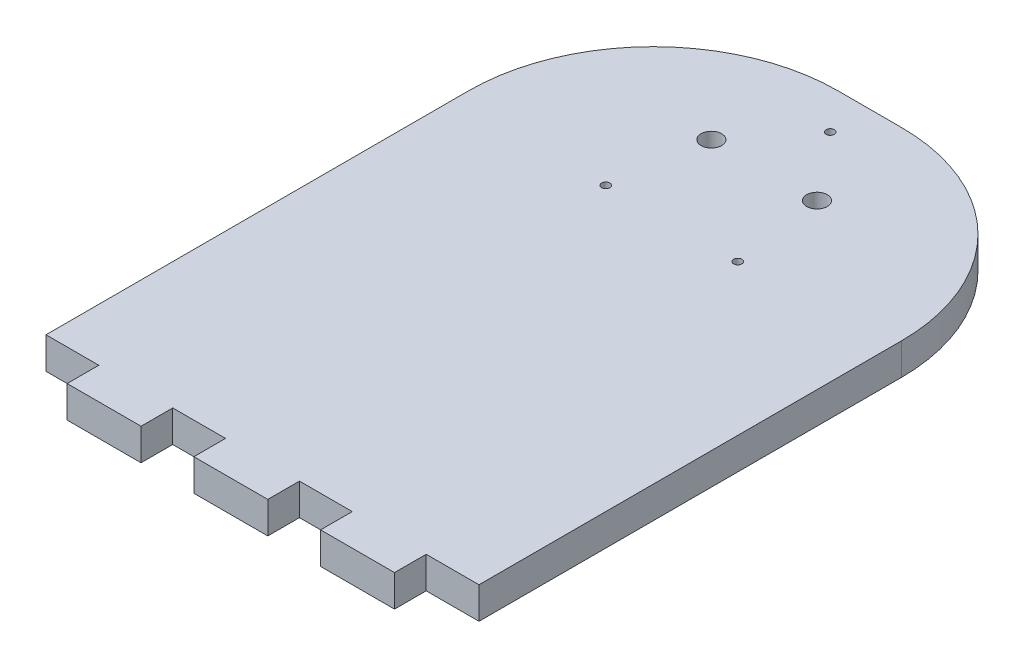
ISO-10303-21;
HEADER;
FILE_DESCRIPTION(('STEP AP214'),'2;1');
FILE_NAME('part.step','',(''),(''),'','','');
FILE_SCHEMA(('AUTOMOTIVE_DESIGN { 1 0 10303 214 1 1 1 1 }'));
ENDSEC;
DATA;
#1=APPLICATION_CONTEXT('core data for automotive mechanical design processes');
#2=APPLICATION_PROTOCOL_DEFINITION('international standard','automotive_design',2000,#1);
#3=PRODUCT_CONTEXT('',#1,'mechanical');
#4=PRODUCT('Part','Part','',(#3));
#5=PRODUCT_RELATED_PRODUCT_CATEGORY('part','',(#4));
#6=PRODUCT_DEFINITION_FORMATION('','',#4);
#7=PRODUCT_DEFINITION_CONTEXT('part definition',#1,'design');
#8=PRODUCT_DEFINITION('design','',#6,#7);
#9=PRODUCT_DEFINITION_SHAPE('','',#8);
#10=(LENGTH_UNIT() NAMED_UNIT(*) SI_UNIT(.MILLI.,.METRE.));
#11=(NAMED_UNIT(*) PLANE_ANGLE_UNIT() SI_UNIT($,.RADIAN.));
#12=(NAMED_UNIT(*) SI_UNIT($,.STERADIAN.) SOLID_ANGLE_UNIT());
#13=UNCERTAINTY_MEASURE_WITH_UNIT(LENGTH_MEASURE(1.E-05),#10,'distance_accuracy_value','');
#14=(GEOMETRIC_REPRESENTATION_CONTEXT(3) GLOBAL_UNCERTAINTY_ASSIGNED_CONTEXT((#13)) GLOBAL_UNIT_ASSIGNED_CONTEXT((#10,
#11,#12)) REPRESENTATION_CONTEXT('',''));
#15=CARTESIAN_POINT('',(0.,0.,0.));
#16=DIRECTION('',(0.,0.,1.));
#17=DIRECTION('',(1.,0.,0.));
#18=AXIS2_PLACEMENT_3D('',#15,#16,#17);
#19=CARTESIAN_POINT('',(164.,12.,-230.));
#20=DIRECTION('',(1.,0.,0.));
#21=DIRECTION('',(0.,0.,-1.));
#22=AXIS2_PLACEMENT_3D('',#19,#20,#21);
#23=PLANE('',#22);
#24=DIRECTION('',(0.,0.,1.));
#25=VECTOR('',#24,1.);
#26=CARTESIAN_POINT('',(164.,0.,-230.));
#27=LINE('',#26,#25);
#28=CARTESIAN_POINT('',(164.,0.,-160.));
#29=VERTEX_POINT('',#28);
#30=CARTESIAN_POINT('',(164.,0.,0.));
#31=VERTEX_POINT('',#30);
#32=EDGE_CURVE('E208',#29,#31,#27,.T.);
#33=ORIENTED_EDGE('',*,*,#32,.F.);
#34=DIRECTION('',(0.,-1.,0.));
#35=VECTOR('',#34,1.);
#36=CARTESIAN_POINT('',(164.,12.,-160.));
#37=LINE('',#36,#35);
#38=CARTESIAN_POINT('',(164.,12.,-160.));
#39=VERTEX_POINT('',#38);
#40=EDGE_CURVE('E56',#29,#39,#37,.F.);
#41=ORIENTED_EDGE('',*,*,#40,.T.);
#42=DIRECTION('',(0.,0.,1.));
#43=VECTOR('',#42,1.);
#44=CARTESIAN_POINT('',(164.,12.,-230.));
#45=LINE('',#44,#43);
#46=CARTESIAN_POINT('',(164.,12.,0.));
#47=VERTEX_POINT('',#46);
#48=EDGE_CURVE('E158',#39,#47,#45,.T.);
#49=ORIENTED_EDGE('',*,*,#48,.T.);
#50=DIRECTION('',(0.,-1.,0.));
#51=VECTOR('',#50,1.);
#52=CARTESIAN_POINT('',(164.,12.,0.));
#53=LINE('',#52,#51);
#54=EDGE_CURVE('E161',#47,#31,#53,.T.);
#55=ORIENTED_EDGE('',*,*,#54,.T.);
#56=EDGE_LOOP('',(#33,#41,#49,#55));
#57=FACE_BOUND('',#56,.T.);
#58=ADVANCED_FACE('F33',(#57),#23,.T.);
#59=CARTESIAN_POINT('',(164.,12.,-230.));
#60=DIRECTION('',(0.,0.,1.));
#61=DIRECTION('',(1.,0.,0.));
#62=AXIS2_PLACEMENT_3D('',#59,#60,#61);
#63=PLANE('',#62);
#64=DIRECTION('',(-1.,0.,0.));
#65=VECTOR('',#64,1.);
#66=CARTESIAN_POINT('',(164.,12.,-230.));
#67=LINE('',#66,#65);
#68=CARTESIAN_POINT('',(94.,12.,-230.));
#69=VERTEX_POINT('',#68);
#70=CARTESIAN_POINT('',(70.,12.,-230.));
#71=VERTEX_POINT('',#70);
#72=EDGE_CURVE('E178',#69,#71,#67,.T.);
#73=ORIENTED_EDGE('',*,*,#72,.F.);
#74=DIRECTION('',(0.,-1.,0.));
#75=VECTOR('',#74,1.);
#76=CARTESIAN_POINT('',(94.,0.,-230.));
#77=LINE('',#76,#75);
#78=CARTESIAN_POINT('',(94.,0.,-230.));
#79=VERTEX_POINT('',#78);
#80=EDGE_CURVE('E188',#69,#79,#77,.T.);
#81=ORIENTED_EDGE('',*,*,#80,.T.);
#82=DIRECTION('',(-1.,0.,0.));
#83=VECTOR('',#82,1.);
#84=CARTESIAN_POINT('',(164.,0.,-230.));
#85=LINE('',#84,#83);
#86=CARTESIAN_POINT('',(70.,0.,-230.));
#87=VERTEX_POINT('',#86);
#88=EDGE_CURVE('E165',#79,#87,#85,.T.);
#89=ORIENTED_EDGE('',*,*,#88,.T.);
#90=DIRECTION('',(0.,-1.,0.));
#91=VECTOR('',#90,1.);
#92=CARTESIAN_POINT('',(70.,12.,-230.));
#93=LINE('',#92,#91);
#94=EDGE_CURVE('E186',#87,#71,#93,.F.);
#95=ORIENTED_EDGE('',*,*,#94,.T.);
#96=EDGE_LOOP('',(#73,#81,#89,#95));
#97=FACE_BOUND('',#96,.T.);
#98=ADVANCED_FACE('F201',(#97),#63,.F.);
#99=CARTESIAN_POINT('',(0.,12.,-230.));
#100=DIRECTION('',(1.,0.,0.));
#101=DIRECTION('',(0.,0.,-1.));
#102=AXIS2_PLACEMENT_3D('',#99,#100,#101);
#103=PLANE('',#102);
#104=DIRECTION('',(0.,0.,1.));
#105=VECTOR('',#104,1.);
#106=CARTESIAN_POINT('',(0.,12.,-230.));
#107=LINE('',#106,#105);
#108=CARTESIAN_POINT('',(0.,12.,-160.));
#109=VERTEX_POINT('',#108);
#110=CARTESIAN_POINT('',(0.,12.,0.));
#111=VERTEX_POINT('',#110);
#112=EDGE_CURVE('E182',#109,#111,#107,.T.);
#113=ORIENTED_EDGE('',*,*,#112,.F.);
#114=DIRECTION('',(0.,-1.,0.));
#115=VECTOR('',#114,1.);
#116=CARTESIAN_POINT('',(0.,12.,-160.));
#117=LINE('',#116,#115);
#118=CARTESIAN_POINT('',(0.,0.,-160.));
#119=VERTEX_POINT('',#118);
#120=EDGE_CURVE('E11',#109,#119,#117,.T.);
#121=ORIENTED_EDGE('',*,*,#120,.T.);
#122=DIRECTION('',(0.,0.,1.));
#123=VECTOR('',#122,1.);
#124=CARTESIAN_POINT('',(0.,0.,-230.));
#125=LINE('',#124,#123);
#126=CARTESIAN_POINT('',(0.,0.,0.));
#127=VERTEX_POINT('',#126);
#128=EDGE_CURVE('E247',#119,#127,#125,.T.);
#129=ORIENTED_EDGE('',*,*,#128,.T.);
#130=DIRECTION('',(0.,-1.,0.));
#131=VECTOR('',#130,1.);
#132=CARTESIAN_POINT('',(0.,12.,0.));
#133=LINE('',#132,#131);
#134=EDGE_CURVE('E189',#111,#127,#133,.T.);
#135=ORIENTED_EDGE('',*,*,#134,.F.);
#136=EDGE_LOOP('',(#113,#121,#129,#135));
#137=FACE_BOUND('',#136,.T.);
#138=ADVANCED_FACE('F347',(#137),#103,.F.);
#139=CARTESIAN_POINT('',(0.,12.,0.));
#140=DIRECTION('',(0.,0.,-1.));
#141=DIRECTION('',(-1.,0.,0.));
#142=AXIS2_PLACEMENT_3D('',#139,#140,#141);
#143=PLANE('',#142);
#144=DIRECTION('',(1.,0.,0.));
#145=VECTOR('',#144,1.);
#146=CARTESIAN_POINT('',(0.,0.,0.));
#147=LINE('',#146,#145);
#148=CARTESIAN_POINT('',(20.,0.,0.));
#149=VERTEX_POINT('',#148);
#150=EDGE_CURVE('E245',#127,#149,#147,.T.);
#151=ORIENTED_EDGE('',*,*,#150,.T.);
#152=DIRECTION('',(0.,-1.,0.));
#153=VECTOR('',#152,1.);
#154=CARTESIAN_POINT('',(20.,12.,0.));
#155=LINE('',#154,#153);
#156=CARTESIAN_POINT('',(20.,12.,0.));
#157=VERTEX_POINT('',#156);
#158=EDGE_CURVE('E252',#157,#149,#155,.T.);
#159=ORIENTED_EDGE('',*,*,#158,.F.);
#160=DIRECTION('',(1.,0.,0.));
#161=VECTOR('',#160,1.);
#162=CARTESIAN_POINT('',(0.,12.,0.));
#163=LINE('',#162,#161);
#164=EDGE_CURVE('E344',#111,#157,#163,.T.);
#165=ORIENTED_EDGE('',*,*,#164,.F.);
#166=ORIENTED_EDGE('',*,*,#134,.T.);
#167=EDGE_LOOP('',(#151,#159,#165,#166));
#168=FACE_BOUND('',#167,.T.);
#169=ADVANCED_FACE('F343',(#168),#143,.F.);
#170=CARTESIAN_POINT('',(20.,12.,0.));
#171=DIRECTION('',(1.,0.,0.));
#172=DIRECTION('',(0.,0.,-1.));
#173=AXIS2_PLACEMENT_3D('',#170,#171,#172);
#174=PLANE('',#173);
#175=DIRECTION('',(0.,0.,1.));
#176=VECTOR('',#175,1.);
#177=CARTESIAN_POINT('',(20.,0.,0.));
#178=LINE('',#177,#176);
#179=CARTESIAN_POINT('',(20.,0.,12.));
#180=VERTEX_POINT('',#179);
#181=EDGE_CURVE('E243',#149,#180,#178,.T.);
#182=ORIENTED_EDGE('',*,*,#181,.T.);
#183=DIRECTION('',(0.,-1.,0.));
#184=VECTOR('',#183,1.);
#185=CARTESIAN_POINT('',(20.,12.,12.));
#186=LINE('',#185,#184);
#187=CARTESIAN_POINT('',(20.,12.,12.));
#188=VERTEX_POINT('',#187);
#189=EDGE_CURVE('E255',#188,#180,#186,.T.);
#190=ORIENTED_EDGE('',*,*,#189,.F.);
#191=DIRECTION('',(0.,0.,1.));
#192=VECTOR('',#191,1.);
#193=CARTESIAN_POINT('',(20.,12.,0.));
#194=LINE('',#193,#192);
#195=EDGE_CURVE('E340',#157,#188,#194,.T.);
#196=ORIENTED_EDGE('',*,*,#195,.F.);
#197=ORIENTED_EDGE('',*,*,#158,.T.);
#198=EDGE_LOOP('',(#182,#190,#196,#197));
#199=FACE_BOUND('',#198,.T.);
#200=ADVANCED_FACE('F337',(#199),#174,.F.);
#201=CARTESIAN_POINT('',(20.,12.,12.));
#202=DIRECTION('',(0.,0.,-1.));
#203=DIRECTION('',(-1.,0.,0.));
#204=AXIS2_PLACEMENT_3D('',#201,#202,#203);
#205=PLANE('',#204);
#206=DIRECTION('',(1.,0.,0.));
#207=VECTOR('',#206,1.);
#208=CARTESIAN_POINT('',(20.,0.,12.));
#209=LINE('',#208,#207);
#210=CARTESIAN_POINT('',(48.,0.,12.));
#211=VERTEX_POINT('',#210);
#212=EDGE_CURVE('E240',#180,#211,#209,.T.);
#213=ORIENTED_EDGE('',*,*,#212,.T.);
#214=DIRECTION('',(0.,-1.,0.));
#215=VECTOR('',#214,1.);
#216=CARTESIAN_POINT('',(48.,12.,12.));
#217=LINE('',#216,#215);
#218=CARTESIAN_POINT('',(48.,12.,12.));
#219=VERTEX_POINT('',#218);
#220=EDGE_CURVE('E258',#219,#211,#217,.T.);
#221=ORIENTED_EDGE('',*,*,#220,.F.);
#222=DIRECTION('',(1.,0.,0.));
#223=VECTOR('',#222,1.);
#224=CARTESIAN_POINT('',(20.,12.,12.));
#225=LINE('',#224,#223);
#226=EDGE_CURVE('E456',#188,#219,#225,.T.);
#227=ORIENTED_EDGE('',*,*,#226,.F.);
#228=ORIENTED_EDGE('',*,*,#189,.T.);
#229=EDGE_LOOP('',(#213,#221,#227,#228));
#230=FACE_BOUND('',#229,.T.);
#231=ADVANCED_FACE('F331',(#230),#205,.F.);
#232=CARTESIAN_POINT('',(48.,12.,0.));
#233=DIRECTION('',(1.,0.,0.));
#234=DIRECTION('',(0.,0.,-1.));
#235=AXIS2_PLACEMENT_3D('',#232,#233,#234);
#236=PLANE('',#235);
#237=DIRECTION('',(0.,0.,1.));
#238=VECTOR('',#237,1.);
#239=CARTESIAN_POINT('',(48.,0.,0.));
#240=LINE('',#239,#238);
#241=CARTESIAN_POINT('',(48.,0.,0.));
#242=VERTEX_POINT('',#241);
#243=EDGE_CURVE('E237',#242,#211,#240,.T.);
#244=ORIENTED_EDGE('',*,*,#243,.F.);
#245=DIRECTION('',(0.,-1.,0.));
#246=VECTOR('',#245,1.);
#247=CARTESIAN_POINT('',(48.,12.,0.));
#248=LINE('',#247,#246);
#249=CARTESIAN_POINT('',(48.,12.,0.));
#250=VERTEX_POINT('',#249);
#251=EDGE_CURVE('E260',#250,#242,#248,.T.);
#252=ORIENTED_EDGE('',*,*,#251,.F.);
#253=DIRECTION('',(0.,0.,1.));
#254=VECTOR('',#253,1.);
#255=CARTESIAN_POINT('',(48.,12.,0.));
#256=LINE('',#255,#254);
#257=EDGE_CURVE('E328',#250,#219,#256,.T.);
#258=ORIENTED_EDGE('',*,*,#257,.T.);
#259=ORIENTED_EDGE('',*,*,#220,.T.);
#260=EDGE_LOOP('',(#244,#252,#258,#259));
#261=FACE_BOUND('',#260,.T.);
#262=ADVANCED_FACE('F325',(#261),#236,.T.);
#263=CARTESIAN_POINT('',(48.,12.,0.));
#264=DIRECTION('',(0.,0.,-1.));
#265=DIRECTION('',(-1.,0.,0.));
#266=AXIS2_PLACEMENT_3D('',#263,#264,#265);
#267=PLANE('',#266);
#268=DIRECTION('',(1.,0.,0.));
#269=VECTOR('',#268,1.);
#270=CARTESIAN_POINT('',(48.,0.,0.));
#271=LINE('',#270,#269);
#272=CARTESIAN_POINT('',(68.,0.,0.));
#273=VERTEX_POINT('',#272);
#274=EDGE_CURVE('E235',#242,#273,#271,.T.);
#275=ORIENTED_EDGE('',*,*,#274,.T.);
#276=DIRECTION('',(0.,-1.,0.));
#277=VECTOR('',#276,1.);
#278=CARTESIAN_POINT('',(68.,12.,0.));
#279=LINE('',#278,#277);
#280=CARTESIAN_POINT('',(68.,12.,0.));
#281=VERTEX_POINT('',#280);
#282=EDGE_CURVE('E262',#281,#273,#279,.T.);
#283=ORIENTED_EDGE('',*,*,#282,.F.);
#284=DIRECTION('',(1.,0.,0.));
#285=VECTOR('',#284,1.);
#286=CARTESIAN_POINT('',(48.,12.,0.));
#287=LINE('',#286,#285);
#288=EDGE_CURVE('E320',#250,#281,#287,.T.);
#289=ORIENTED_EDGE('',*,*,#288,.F.);
#290=ORIENTED_EDGE('',*,*,#251,.T.);
#291=EDGE_LOOP('',(#275,#283,#289,#290));
#292=FACE_BOUND('',#291,.T.);
#293=ADVANCED_FACE('F319',(#292),#267,.F.);
#294=CARTESIAN_POINT('',(68.,12.,0.));
#295=DIRECTION('',(1.,0.,0.));
#296=DIRECTION('',(0.,0.,-1.));
#297=AXIS2_PLACEMENT_3D('',#294,#295,#296);
#298=PLANE('',#297);
#299=DIRECTION('',(0.,0.,1.));
#300=VECTOR('',#299,1.);
#301=CARTESIAN_POINT('',(68.,0.,0.));
#302=LINE('',#301,#300);
#303=CARTESIAN_POINT('',(68.,0.,12.));
#304=VERTEX_POINT('',#303);
#305=EDGE_CURVE('E233',#273,#304,#302,.T.);
#306=ORIENTED_EDGE('',*,*,#305,.T.);
#307=DIRECTION('',(0.,-1.,0.));
#308=VECTOR('',#307,1.);
#309=CARTESIAN_POINT('',(68.,12.,12.));
#310=LINE('',#309,#308);
#311=CARTESIAN_POINT('',(68.,12.,12.));
#312=VERTEX_POINT('',#311);
#313=EDGE_CURVE('E265',#312,#304,#310,.T.);
#314=ORIENTED_EDGE('',*,*,#313,.F.);
#315=DIRECTION('',(0.,0.,1.));
#316=VECTOR('',#315,1.);
#317=CARTESIAN_POINT('',(68.,12.,0.));
#318=LINE('',#317,#316);
#319=EDGE_CURVE('E315',#281,#312,#318,.T.);
#320=ORIENTED_EDGE('',*,*,#319,.F.);
#321=ORIENTED_EDGE('',*,*,#282,.T.);
#322=EDGE_LOOP('',(#306,#314,#320,#321));
#323=FACE_BOUND('',#322,.T.);
#324=ADVANCED_FACE('F314',(#323),#298,.F.);
#325=CARTESIAN_POINT('',(68.,12.,12.));
#326=DIRECTION('',(0.,0.,-1.));
#327=DIRECTION('',(-1.,0.,0.));
#328=AXIS2_PLACEMENT_3D('',#325,#326,#327);
#329=PLANE('',#328);
#330=DIRECTION('',(1.,0.,0.));
#331=VECTOR('',#330,1.);
#332=CARTESIAN_POINT('',(68.,0.,12.));
#333=LINE('',#332,#331);
#334=CARTESIAN_POINT('',(96.,0.,12.));
#335=VERTEX_POINT('',#334);
#336=EDGE_CURVE('E230',#304,#335,#333,.T.);
#337=ORIENTED_EDGE('',*,*,#336,.T.);
#338=DIRECTION('',(0.,-1.,0.));
#339=VECTOR('',#338,1.);
#340=CARTESIAN_POINT('',(96.,12.,12.));
#341=LINE('',#340,#339);
#342=CARTESIAN_POINT('',(96.,12.,12.));
#343=VERTEX_POINT('',#342);
#344=EDGE_CURVE('E268',#343,#335,#341,.T.);
#345=ORIENTED_EDGE('',*,*,#344,.F.);
#346=DIRECTION('',(1.,0.,0.));
#347=VECTOR('',#346,1.);
#348=CARTESIAN_POINT('',(68.,12.,12.));
#349=LINE('',#348,#347);
#350=EDGE_CURVE('E311',#312,#343,#349,.T.);
#351=ORIENTED_EDGE('',*,*,#350,.F.);
#352=ORIENTED_EDGE('',*,*,#313,.T.);
#353=EDGE_LOOP('',(#337,#345,#351,#352));
#354=FACE_BOUND('',#353,.T.);
#355=ADVANCED_FACE('F308',(#354),#329,.F.);
#356=CARTESIAN_POINT('',(96.,12.,0.));
#357=DIRECTION('',(1.,0.,0.));
#358=DIRECTION('',(0.,0.,-1.));
#359=AXIS2_PLACEMENT_3D('',#356,#357,#358);
#360=PLANE('',#359);
#361=DIRECTION('',(0.,0.,1.));
#362=VECTOR('',#361,1.);
#363=CARTESIAN_POINT('',(96.,0.,0.));
#364=LINE('',#363,#362);
#365=CARTESIAN_POINT('',(96.,0.,0.));
#366=VERTEX_POINT('',#365);
#367=EDGE_CURVE('E227',#366,#335,#364,.T.);
#368=ORIENTED_EDGE('',*,*,#367,.F.);
#369=DIRECTION('',(0.,-1.,0.));
#370=VECTOR('',#369,1.);
#371=CARTESIAN_POINT('',(96.,12.,0.));
#372=LINE('',#371,#370);
#373=CARTESIAN_POINT('',(96.,12.,0.));
#374=VERTEX_POINT('',#373);
#375=EDGE_CURVE('E270',#374,#366,#372,.T.);
#376=ORIENTED_EDGE('',*,*,#375,.F.);
#377=DIRECTION('',(0.,0.,1.));
#378=VECTOR('',#377,1.);
#379=CARTESIAN_POINT('',(96.,12.,0.));
#380=LINE('',#379,#378);
#381=EDGE_CURVE('E302',#374,#343,#380,.T.);
#382=ORIENTED_EDGE('',*,*,#381,.T.);
#383=ORIENTED_EDGE('',*,*,#344,.T.);
#384=EDGE_LOOP('',(#368,#376,#382,#383));
#385=FACE_BOUND('',#384,.T.);
#386=ADVANCED_FACE('F301',(#385),#360,.T.);
#387=CARTESIAN_POINT('',(96.,12.,0.));
#388=DIRECTION('',(0.,0.,-1.));
#389=DIRECTION('',(-1.,0.,0.));
#390=AXIS2_PLACEMENT_3D('',#387,#388,#389);
#391=PLANE('',#390);
#392=DIRECTION('',(1.,0.,0.));
#393=VECTOR('',#392,1.);
#394=CARTESIAN_POINT('',(96.,0.,0.));
#395=LINE('',#394,#393);
#396=CARTESIAN_POINT('',(116.,0.,0.));
#397=VERTEX_POINT('',#396);
#398=EDGE_CURVE('E225',#366,#397,#395,.T.);
#399=ORIENTED_EDGE('',*,*,#398,.T.);
#400=DIRECTION('',(0.,-1.,0.));
#401=VECTOR('',#400,1.);
#402=CARTESIAN_POINT('',(116.,12.,0.));
#403=LINE('',#402,#401);
#404=CARTESIAN_POINT('',(116.,12.,0.));
#405=VERTEX_POINT('',#404);
#406=EDGE_CURVE('E272',#405,#397,#403,.T.);
#407=ORIENTED_EDGE('',*,*,#406,.F.);
#408=DIRECTION('',(1.,0.,0.));
#409=VECTOR('',#408,1.);
#410=CARTESIAN_POINT('',(96.,12.,0.));
#411=LINE('',#410,#409);
#412=EDGE_CURVE('E297',#374,#405,#411,.T.);
#413=ORIENTED_EDGE('',*,*,#412,.F.);
#414=ORIENTED_EDGE('',*,*,#375,.T.);
#415=EDGE_LOOP('',(#399,#407,#413,#414));
#416=FACE_BOUND('',#415,.T.);
#417=ADVANCED_FACE('F296',(#416),#391,.F.);
#418=CARTESIAN_POINT('',(116.,12.,0.));
#419=DIRECTION('',(1.,0.,0.));
#420=DIRECTION('',(0.,0.,-1.));
#421=AXIS2_PLACEMENT_3D('',#418,#419,#420);
#422=PLANE('',#421);
#423=DIRECTION('',(0.,0.,1.));
#424=VECTOR('',#423,1.);
#425=CARTESIAN_POINT('',(116.,0.,0.));
#426=LINE('',#425,#424);
#427=CARTESIAN_POINT('',(116.,0.,12.));
#428=VERTEX_POINT('',#427);
#429=EDGE_CURVE('E223',#397,#428,#426,.T.);
#430=ORIENTED_EDGE('',*,*,#429,.T.);
#431=DIRECTION('',(0.,-1.,0.));
#432=VECTOR('',#431,1.);
#433=CARTESIAN_POINT('',(116.,12.,12.));
#434=LINE('',#433,#432);
#435=CARTESIAN_POINT('',(116.,12.,12.));
#436=VERTEX_POINT('',#435);
#437=EDGE_CURVE('E275',#436,#428,#434,.T.);
#438=ORIENTED_EDGE('',*,*,#437,.F.);
#439=DIRECTION('',(0.,0.,1.));
#440=VECTOR('',#439,1.);
#441=CARTESIAN_POINT('',(116.,12.,0.));
#442=LINE('',#441,#440);
#443=EDGE_CURVE('E293',#405,#436,#442,.T.);
#444=ORIENTED_EDGE('',*,*,#443,.F.);
#445=ORIENTED_EDGE('',*,*,#406,.T.);
#446=EDGE_LOOP('',(#430,#438,#444,#445));
#447=FACE_BOUND('',#446,.T.);
#448=ADVANCED_FACE('F290',(#447),#422,.F.);
#449=CARTESIAN_POINT('',(116.,12.,12.));
#450=DIRECTION('',(0.,0.,-1.));
#451=DIRECTION('',(-1.,0.,0.));
#452=AXIS2_PLACEMENT_3D('',#449,#450,#451);
#453=PLANE('',#452);
#454=DIRECTION('',(1.,0.,0.));
#455=VECTOR('',#454,1.);
#456=CARTESIAN_POINT('',(116.,0.,12.));
#457=LINE('',#456,#455);
#458=CARTESIAN_POINT('',(144.,0.,12.));
#459=VERTEX_POINT('',#458);
#460=EDGE_CURVE('E220',#428,#459,#457,.T.);
#461=ORIENTED_EDGE('',*,*,#460,.T.);
#462=DIRECTION('',(0.,-1.,0.));
#463=VECTOR('',#462,1.);
#464=CARTESIAN_POINT('',(144.,12.,12.));
#465=LINE('',#464,#463);
#466=CARTESIAN_POINT('',(144.,12.,12.));
#467=VERTEX_POINT('',#466);
#468=EDGE_CURVE('E180',#467,#459,#465,.T.);
#469=ORIENTED_EDGE('',*,*,#468,.F.);
#470=DIRECTION('',(1.,0.,0.));
#471=VECTOR('',#470,1.);
#472=CARTESIAN_POINT('',(116.,12.,12.));
#473=LINE('',#472,#471);
#474=EDGE_CURVE('E447',#436,#467,#473,.T.);
#475=ORIENTED_EDGE('',*,*,#474,.F.);
#476=ORIENTED_EDGE('',*,*,#437,.T.);
#477=EDGE_LOOP('',(#461,#469,#475,#476));
#478=FACE_BOUND('',#477,.T.);
#479=ADVANCED_FACE('F284',(#478),#453,.F.);
#480=CARTESIAN_POINT('',(144.,12.,0.));
#481=DIRECTION('',(1.,0.,0.));
#482=DIRECTION('',(0.,0.,-1.));
#483=AXIS2_PLACEMENT_3D('',#480,#481,#482);
#484=PLANE('',#483);
#485=DIRECTION('',(0.,0.,1.));
#486=VECTOR('',#485,1.);
#487=CARTESIAN_POINT('',(144.,0.,0.));
#488=LINE('',#487,#486);
#489=CARTESIAN_POINT('',(144.,0.,0.));
#490=VERTEX_POINT('',#489);
#491=EDGE_CURVE('E211',#490,#459,#488,.T.);
#492=ORIENTED_EDGE('',*,*,#491,.F.);
#493=DIRECTION('',(0.,-1.,0.));
#494=VECTOR('',#493,1.);
#495=CARTESIAN_POINT('',(144.,12.,0.));
#496=LINE('',#495,#494);
#497=CARTESIAN_POINT('',(144.,12.,0.));
#498=VERTEX_POINT('',#497);
#499=EDGE_CURVE('E177',#498,#490,#496,.T.);
#500=ORIENTED_EDGE('',*,*,#499,.F.);
#501=DIRECTION('',(0.,0.,1.));
#502=VECTOR('',#501,1.);
#503=CARTESIAN_POINT('',(144.,12.,0.));
#504=LINE('',#503,#502);
#505=EDGE_CURVE('E171',#498,#467,#504,.T.);
#506=ORIENTED_EDGE('',*,*,#505,.T.);
#507=ORIENTED_EDGE('',*,*,#468,.T.);
#508=EDGE_LOOP('',(#492,#500,#506,#507));
#509=FACE_BOUND('',#508,.T.);
#510=ADVANCED_FACE('F280',(#509),#484,.T.);
#511=CARTESIAN_POINT('',(144.,12.,0.));
#512=DIRECTION('',(0.,0.,-1.));
#513=DIRECTION('',(-1.,0.,0.));
#514=AXIS2_PLACEMENT_3D('',#511,#512,#513);
#515=PLANE('',#514);
#516=DIRECTION('',(1.,0.,0.));
#517=VECTOR('',#516,1.);
#518=CARTESIAN_POINT('',(144.,0.,0.));
#519=LINE('',#518,#517);
#520=EDGE_CURVE('E176',#490,#31,#519,.T.);
#521=ORIENTED_EDGE('',*,*,#520,.T.);
#522=ORIENTED_EDGE('',*,*,#54,.F.);
#523=DIRECTION('',(1.,0.,0.));
#524=VECTOR('',#523,1.);
#525=CARTESIAN_POINT('',(144.,12.,0.));
#526=LINE('',#525,#524);
#527=EDGE_CURVE('E164',#498,#47,#526,.T.);
#528=ORIENTED_EDGE('',*,*,#527,.F.);
#529=ORIENTED_EDGE('',*,*,#499,.T.);
#530=EDGE_LOOP('',(#521,#522,#528,#529));
#531=FACE_BOUND('',#530,.T.);
#532=ADVANCED_FACE('F174',(#531),#515,.F.);
#533=CARTESIAN_POINT('',(0.,12.,0.));
#534=DIRECTION('',(0.,1.,0.));
#535=DIRECTION('',(0.,0.,1.));
#536=AXIS2_PLACEMENT_3D('',#533,#534,#535);
#537=PLANE('',#536);
#538=CARTESIAN_POINT('',(102.,12.,-190.));
#539=DIRECTION('',(0.,1.,0.));
#540=DIRECTION('',(0.,0.,1.));
#541=AXIS2_PLACEMENT_3D('',#538,#539,#540);
#542=CIRCLE('',#541,3.89999999999998);
#543=CARTESIAN_POINT('',(102.,12.,-186.1));
#544=VERTEX_POINT('',#543);
#545=EDGE_CURVE('E422',#544,#544,#542,.T.);
#546=ORIENTED_EDGE('',*,*,#545,.F.);
#547=EDGE_LOOP('',(#546));
#548=FACE_BOUND('',#547,.T.);
#549=CARTESIAN_POINT('',(62.,12.,-190.));
#550=DIRECTION('',(0.,1.,0.));
#551=DIRECTION('',(0.,0.,1.));
#552=AXIS2_PLACEMENT_3D('',#549,#550,#551);
#553=CIRCLE('',#552,3.89999999999996);
#554=CARTESIAN_POINT('',(62.,12.,-186.1));
#555=VERTEX_POINT('',#554);
#556=EDGE_CURVE('E424',#555,#555,#553,.T.);
#557=ORIENTED_EDGE('',*,*,#556,.F.);
#558=EDGE_LOOP('',(#557));
#559=FACE_BOUND('',#558,.T.);
#560=CARTESIAN_POINT('',(107.,12.,-155.));
#561=DIRECTION('',(0.,1.,0.));
#562=DIRECTION('',(0.,0.,1.));
#563=AXIS2_PLACEMENT_3D('',#560,#561,#562);
#564=CIRCLE('',#563,1.54999999999999);
#565=CARTESIAN_POINT('',(107.,12.,-153.45));
#566=VERTEX_POINT('',#565);
#567=EDGE_CURVE('E432',#566,#566,#564,.T.);
#568=ORIENTED_EDGE('',*,*,#567,.F.);
#569=EDGE_LOOP('',(#568));
#570=FACE_BOUND('',#569,.T.);
#571=CARTESIAN_POINT('',(57.,12.,-155.));
#572=DIRECTION('',(0.,1.,0.));
#573=DIRECTION('',(0.,0.,1.));
#574=AXIS2_PLACEMENT_3D('',#571,#572,#573);
#575=CIRCLE('',#574,1.54999999999999);
#576=CARTESIAN_POINT('',(57.,12.,-153.45));
#577=VERTEX_POINT('',#576);
#578=EDGE_CURVE('E438',#577,#577,#575,.T.);
#579=ORIENTED_EDGE('',*,*,#578,.F.);
#580=EDGE_LOOP('',(#579));
#581=FACE_BOUND('',#580,.T.);
#582=CARTESIAN_POINT('',(82.,12.,-215.));
#583=DIRECTION('',(0.,1.,0.));
#584=DIRECTION('',(0.,0.,1.));
#585=AXIS2_PLACEMENT_3D('',#582,#583,#584);
#586=CIRCLE('',#585,1.54999999999999);
#587=CARTESIAN_POINT('',(82.,12.,-213.45));
#588=VERTEX_POINT('',#587);
#589=EDGE_CURVE('E214',#588,#588,#586,.T.);
#590=ORIENTED_EDGE('',*,*,#589,.F.);
#591=EDGE_LOOP('',(#590));
#592=FACE_BOUND('',#591,.T.);
#593=ORIENTED_EDGE('',*,*,#48,.F.);
#594=CARTESIAN_POINT('',(94.,12.,-160.));
#595=DIRECTION('',(0.,1.,0.));
#596=DIRECTION('',(0.,0.,1.));
#597=AXIS2_PLACEMENT_3D('',#594,#595,#596);
#598=CIRCLE('',#597,70.);
#599=EDGE_CURVE('E41',#39,#69,#598,.T.);
#600=ORIENTED_EDGE('',*,*,#599,.T.);
#601=ORIENTED_EDGE('',*,*,#72,.T.);
#602=CARTESIAN_POINT('',(70.,12.,-160.));
#603=DIRECTION('',(0.,1.,0.));
#604=DIRECTION('',(0.,0.,1.));
#605=AXIS2_PLACEMENT_3D('',#602,#603,#604);
#606=CIRCLE('',#605,70.);
#607=EDGE_CURVE('E48',#71,#109,#606,.T.);
#608=ORIENTED_EDGE('',*,*,#607,.T.);
#609=ORIENTED_EDGE('',*,*,#112,.T.);
#610=ORIENTED_EDGE('',*,*,#164,.T.);
#611=ORIENTED_EDGE('',*,*,#195,.T.);
#612=ORIENTED_EDGE('',*,*,#226,.T.);
#613=ORIENTED_EDGE('',*,*,#257,.F.);
#614=ORIENTED_EDGE('',*,*,#288,.T.);
#615=ORIENTED_EDGE('',*,*,#319,.T.);
#616=ORIENTED_EDGE('',*,*,#350,.T.);
#617=ORIENTED_EDGE('',*,*,#381,.F.);
#618=ORIENTED_EDGE('',*,*,#412,.T.);
#619=ORIENTED_EDGE('',*,*,#443,.T.);
#620=ORIENTED_EDGE('',*,*,#474,.T.);
#621=ORIENTED_EDGE('',*,*,#505,.F.);
#622=ORIENTED_EDGE('',*,*,#527,.T.);
#623=EDGE_LOOP('',(#593,#600,#601,#608,#609,#610,#611,#612,#613,#614,#615,#616,#617,#618,#619,
#620,#621,#622));
#624=FACE_BOUND('',#623,.T.);
#625=ADVANCED_FACE('F169',(#548,#559,#570,#581,#592,#624),#537,.T.);
#626=CARTESIAN_POINT('',(0.,0.,0.));
#627=DIRECTION('',(0.,1.,0.));
#628=DIRECTION('',(0.,0.,1.));
#629=AXIS2_PLACEMENT_3D('',#626,#627,#628);
#630=PLANE('',#629);
#631=CARTESIAN_POINT('',(102.,0.,-190.));
#632=DIRECTION('',(0.,1.,0.));
#633=DIRECTION('',(0.,0.,1.));
#634=AXIS2_PLACEMENT_3D('',#631,#632,#633);
#635=CIRCLE('',#634,3.89999999999998);
#636=CARTESIAN_POINT('',(102.,0.,-186.1));
#637=VERTEX_POINT('',#636);
#638=EDGE_CURVE('E419',#637,#637,#635,.F.);
#639=ORIENTED_EDGE('',*,*,#638,.F.);
#640=EDGE_LOOP('',(#639));
#641=FACE_BOUND('',#640,.T.);
#642=CARTESIAN_POINT('',(62.,0.,-190.));
#643=DIRECTION('',(0.,1.,0.));
#644=DIRECTION('',(0.,0.,1.));
#645=AXIS2_PLACEMENT_3D('',#642,#643,#644);
#646=CIRCLE('',#645,3.89999999999996);
#647=CARTESIAN_POINT('',(62.,0.,-186.1));
#648=VERTEX_POINT('',#647);
#649=EDGE_CURVE('E429',#648,#648,#646,.F.);
#650=ORIENTED_EDGE('',*,*,#649,.F.);
#651=EDGE_LOOP('',(#650));
#652=FACE_BOUND('',#651,.T.);
#653=CARTESIAN_POINT('',(107.,0.,-155.));
#654=DIRECTION('',(0.,1.,0.));
#655=DIRECTION('',(0.,0.,1.));
#656=AXIS2_PLACEMENT_3D('',#653,#654,#655);
#657=CIRCLE('',#656,1.54999999999999);
#658=CARTESIAN_POINT('',(107.,0.,-153.45));
#659=VERTEX_POINT('',#658);
#660=EDGE_CURVE('E435',#659,#659,#657,.F.);
#661=ORIENTED_EDGE('',*,*,#660,.F.);
#662=EDGE_LOOP('',(#661));
#663=FACE_BOUND('',#662,.T.);
#664=CARTESIAN_POINT('',(57.,0.,-155.));
#665=DIRECTION('',(0.,1.,0.));
#666=DIRECTION('',(0.,0.,1.));
#667=AXIS2_PLACEMENT_3D('',#664,#665,#666);
#668=CIRCLE('',#667,1.54999999999999);
#669=CARTESIAN_POINT('',(57.,0.,-153.45));
#670=VERTEX_POINT('',#669);
#671=EDGE_CURVE('E441',#670,#670,#668,.F.);
#672=ORIENTED_EDGE('',*,*,#671,.F.);
#673=EDGE_LOOP('',(#672));
#674=FACE_BOUND('',#673,.T.);
#675=CARTESIAN_POINT('',(82.,0.,-215.));
#676=DIRECTION('',(0.,1.,0.));
#677=DIRECTION('',(0.,0.,1.));
#678=AXIS2_PLACEMENT_3D('',#675,#676,#677);
#679=CIRCLE('',#678,1.54999999999999);
#680=CARTESIAN_POINT('',(82.,0.,-213.45));
#681=VERTEX_POINT('',#680);
#682=EDGE_CURVE('E209',#681,#681,#679,.F.);
#683=ORIENTED_EDGE('',*,*,#682,.F.);
#684=EDGE_LOOP('',(#683));
#685=FACE_BOUND('',#684,.T.);
#686=ORIENTED_EDGE('',*,*,#88,.F.);
#687=CARTESIAN_POINT('',(94.,0.,-160.));
#688=DIRECTION('',(0.,1.,0.));
#689=DIRECTION('',(0.,0.,1.));
#690=AXIS2_PLACEMENT_3D('',#687,#688,#689);
#691=CIRCLE('',#690,70.);
#692=EDGE_CURVE('E194',#79,#29,#691,.F.);
#693=ORIENTED_EDGE('',*,*,#692,.T.);
#694=ORIENTED_EDGE('',*,*,#32,.T.);
#695=ORIENTED_EDGE('',*,*,#520,.F.);
#696=ORIENTED_EDGE('',*,*,#491,.T.);
#697=ORIENTED_EDGE('',*,*,#460,.F.);
#698=ORIENTED_EDGE('',*,*,#429,.F.);
#699=ORIENTED_EDGE('',*,*,#398,.F.);
#700=ORIENTED_EDGE('',*,*,#367,.T.);
#701=ORIENTED_EDGE('',*,*,#336,.F.);
#702=ORIENTED_EDGE('',*,*,#305,.F.);
#703=ORIENTED_EDGE('',*,*,#274,.F.);
#704=ORIENTED_EDGE('',*,*,#243,.T.);
#705=ORIENTED_EDGE('',*,*,#212,.F.);
#706=ORIENTED_EDGE('',*,*,#181,.F.);
#707=ORIENTED_EDGE('',*,*,#150,.F.);
#708=ORIENTED_EDGE('',*,*,#128,.F.);
#709=CARTESIAN_POINT('',(70.,0.,-160.));
#710=DIRECTION('',(0.,1.,0.));
#711=DIRECTION('',(0.,0.,1.));
#712=AXIS2_PLACEMENT_3D('',#709,#710,#711);
#713=CIRCLE('',#712,70.);
#714=EDGE_CURVE('E192',#119,#87,#713,.F.);
#715=ORIENTED_EDGE('',*,*,#714,.T.);
#716=EDGE_LOOP('',(#686,#693,#694,#695,#696,#697,#698,#699,#700,#701,#702,#703,#704,#705,#706,
#707,#708,#715));
#717=FACE_BOUND('',#716,.T.);
#718=ADVANCED_FACE('F207',(#641,#652,#663,#674,#685,#717),#630,.F.);
#719=CARTESIAN_POINT('',(82.,-11.0308657865101,-215.));
#720=DIRECTION('',(0.,1.,0.));
#721=DIRECTION('',(0.,0.,1.));
#722=AXIS2_PLACEMENT_3D('',#719,#720,#721);
#723=CYLINDRICAL_SURFACE('',#722,1.54999999999999);
#724=ORIENTED_EDGE('',*,*,#682,.T.);
#725=EDGE_LOOP('',(#724));
#726=FACE_BOUND('',#725,.T.);
#727=ORIENTED_EDGE('',*,*,#589,.T.);
#728=EDGE_LOOP('',(#727));
#729=FACE_BOUND('',#728,.T.);
#730=ADVANCED_FACE('F392',(#726,#729),#723,.F.);
#731=CARTESIAN_POINT('',(57.,-11.0308657865101,-155.));
#732=DIRECTION('',(0.,1.,0.));
#733=DIRECTION('',(0.,0.,1.));
#734=AXIS2_PLACEMENT_3D('',#731,#732,#733);
#735=CYLINDRICAL_SURFACE('',#734,1.54999999999999);
#736=ORIENTED_EDGE('',*,*,#671,.T.);
#737=EDGE_LOOP('',(#736));
#738=FACE_BOUND('',#737,.T.);
#739=ORIENTED_EDGE('',*,*,#578,.T.);
#740=EDGE_LOOP('',(#739));
#741=FACE_BOUND('',#740,.T.);
#742=ADVANCED_FACE('F399',(#738,#741),#735,.F.);
#743=CARTESIAN_POINT('',(107.,-11.0308657865101,-155.));
#744=DIRECTION('',(0.,1.,0.));
#745=DIRECTION('',(0.,0.,1.));
#746=AXIS2_PLACEMENT_3D('',#743,#744,#745);
#747=CYLINDRICAL_SURFACE('',#746,1.54999999999999);
#748=ORIENTED_EDGE('',*,*,#660,.T.);
#749=EDGE_LOOP('',(#748));
#750=FACE_BOUND('',#749,.T.);
#751=ORIENTED_EDGE('',*,*,#567,.T.);
#752=EDGE_LOOP('',(#751));
#753=FACE_BOUND('',#752,.T.);
#754=ADVANCED_FACE('F403',(#750,#753),#747,.F.);
#755=CARTESIAN_POINT('',(62.,-11.0308657865101,-190.));
#756=DIRECTION('',(0.,1.,0.));
#757=DIRECTION('',(0.,0.,1.));
#758=AXIS2_PLACEMENT_3D('',#755,#756,#757);
#759=CYLINDRICAL_SURFACE('',#758,3.89999999999996);
#760=ORIENTED_EDGE('',*,*,#649,.T.);
#761=EDGE_LOOP('',(#760));
#762=FACE_BOUND('',#761,.T.);
#763=ORIENTED_EDGE('',*,*,#556,.T.);
#764=EDGE_LOOP('',(#763));
#765=FACE_BOUND('',#764,.T.);
#766=ADVANCED_FACE('F407',(#762,#765),#759,.F.);
#767=CARTESIAN_POINT('',(102.,-11.0308657865101,-190.));
#768=DIRECTION('',(0.,1.,0.));
#769=DIRECTION('',(0.,0.,1.));
#770=AXIS2_PLACEMENT_3D('',#767,#768,#769);
#771=CYLINDRICAL_SURFACE('',#770,3.89999999999998);
#772=ORIENTED_EDGE('',*,*,#638,.T.);
#773=EDGE_LOOP('',(#772));
#774=FACE_BOUND('',#773,.T.);
#775=ORIENTED_EDGE('',*,*,#545,.T.);
#776=EDGE_LOOP('',(#775));
#777=FACE_BOUND('',#776,.T.);
#778=ADVANCED_FACE('F354',(#774,#777),#771,.F.);
#779=CARTESIAN_POINT('',(94.,12.,-160.));
#780=DIRECTION('',(0.,1.,0.));
#781=DIRECTION('',(0.,0.,1.));
#782=AXIS2_PLACEMENT_3D('',#779,#780,#781);
#783=CYLINDRICAL_SURFACE('',#782,70.);
#784=ORIENTED_EDGE('',*,*,#599,.F.);
#785=ORIENTED_EDGE('',*,*,#40,.F.);
#786=ORIENTED_EDGE('',*,*,#692,.F.);
#787=ORIENTED_EDGE('',*,*,#80,.F.);
#788=EDGE_LOOP('',(#784,#785,#786,#787));
#789=FACE_BOUND('',#788,.T.);
#790=ADVANCED_FACE('F205',(#789),#783,.T.);
#791=CARTESIAN_POINT('',(70.,12.,-160.));
#792=DIRECTION('',(0.,-1.,0.));
#793=DIRECTION('',(0.,0.,-1.));
#794=AXIS2_PLACEMENT_3D('',#791,#792,#793);
#795=CYLINDRICAL_SURFACE('',#794,70.);
#796=ORIENTED_EDGE('',*,*,#607,.F.);
#797=ORIENTED_EDGE('',*,*,#94,.F.);
#798=ORIENTED_EDGE('',*,*,#714,.F.);
#799=ORIENTED_EDGE('',*,*,#120,.F.);
#800=EDGE_LOOP('',(#796,#797,#798,#799));
#801=FACE_BOUND('',#800,.T.);
#802=ADVANCED_FACE('F35',(#801),#795,.T.);
#803=CLOSED_SHELL('',(#58,#98,#138,#169,#200,#231,#262,#293,#324,#355,#386,#417,#448,#479,#510,
#532,#625,#718,#730,#742,#754,#766,#778,#790,#802));
#804=MANIFOLD_SOLID_BREP('B2',#803);
#805=ADVANCED_BREP_SHAPE_REPRESENTATION('',(#18,#804),#14);
#806=SHAPE_DEFINITION_REPRESENTATION(#9,#805);
ENDSEC;
END-ISO-10303-21;
